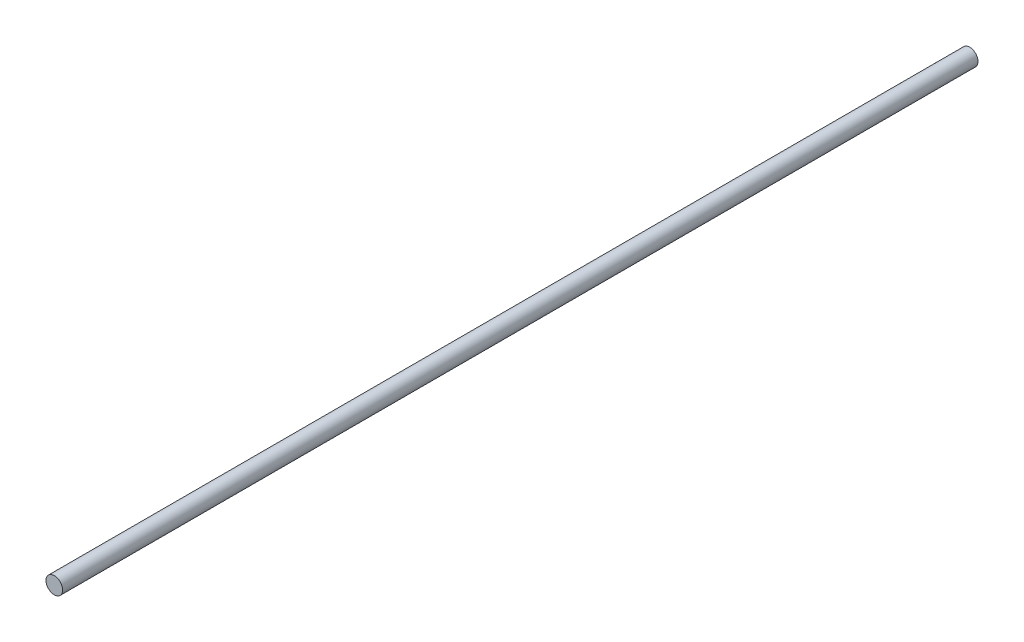
ISO-10303-21;
HEADER;
FILE_DESCRIPTION(('STEP AP214'),'2;1');
FILE_NAME('part.step','',(''),(''),'','','');
FILE_SCHEMA(('AUTOMOTIVE_DESIGN { 1 0 10303 214 1 1 1 1 }'));
ENDSEC;
DATA;
#1=APPLICATION_CONTEXT('core data for automotive mechanical design processes');
#2=APPLICATION_PROTOCOL_DEFINITION('international standard','automotive_design',2000,#1);
#3=PRODUCT_CONTEXT('',#1,'mechanical');
#4=PRODUCT('Part','Part','',(#3));
#5=PRODUCT_RELATED_PRODUCT_CATEGORY('part','',(#4));
#6=PRODUCT_DEFINITION_FORMATION('','',#4);
#7=PRODUCT_DEFINITION_CONTEXT('part definition',#1,'design');
#8=PRODUCT_DEFINITION('design','',#6,#7);
#9=PRODUCT_DEFINITION_SHAPE('','',#8);
#10=(LENGTH_UNIT() NAMED_UNIT(*) SI_UNIT(.MILLI.,.METRE.));
#11=(NAMED_UNIT(*) PLANE_ANGLE_UNIT() SI_UNIT($,.RADIAN.));
#12=(NAMED_UNIT(*) SI_UNIT($,.STERADIAN.) SOLID_ANGLE_UNIT());
#13=UNCERTAINTY_MEASURE_WITH_UNIT(LENGTH_MEASURE(1.E-05),#10,'distance_accuracy_value','');
#14=(GEOMETRIC_REPRESENTATION_CONTEXT(3) GLOBAL_UNCERTAINTY_ASSIGNED_CONTEXT((#13)) GLOBAL_UNIT_ASSIGNED_CONTEXT((#10,
#11,#12)) REPRESENTATION_CONTEXT('',''));
#15=CARTESIAN_POINT('',(0.,0.,0.));
#16=DIRECTION('',(0.,0.,1.));
#17=DIRECTION('',(1.,0.,0.));
#18=AXIS2_PLACEMENT_3D('',#15,#16,#17);
#19=CARTESIAN_POINT('',(585.82877483887,-54.8048450130893,372.15669913756));
#20=DIRECTION('',(0.,0.,1.));
#21=DIRECTION('',(1.,0.,0.));
#22=AXIS2_PLACEMENT_3D('',#19,#20,#21);
#23=CYLINDRICAL_SURFACE('',#22,4.);
#24=CARTESIAN_POINT('',(585.82877483887,-54.8048450130893,372.15669913756));
#25=DIRECTION('',(0.,0.,1.));
#26=DIRECTION('',(1.,0.,0.));
#27=AXIS2_PLACEMENT_3D('',#24,#25,#26);
#28=CIRCLE('',#27,4.);
#29=CARTESIAN_POINT('',(589.82877483887,-54.8048450130893,372.15669913756));
#30=VERTEX_POINT('',#29);
#31=EDGE_CURVE('E10',#30,#30,#28,.T.);
#32=ORIENTED_EDGE('',*,*,#31,.T.);
#33=EDGE_LOOP('',(#32));
#34=FACE_BOUND('',#33,.T.);
#35=CARTESIAN_POINT('',(585.82877483887,-54.8048450130893,812.156699137525));
#36=DIRECTION('',(0.,0.,1.));
#37=DIRECTION('',(1.,0.,0.));
#38=AXIS2_PLACEMENT_3D('',#35,#36,#37);
#39=CIRCLE('',#38,4.);
#40=CARTESIAN_POINT('',(589.82877483887,-54.8048450130893,812.156699137525));
#41=VERTEX_POINT('',#40);
#42=EDGE_CURVE('E36',#41,#41,#39,.T.);
#43=ORIENTED_EDGE('',*,*,#42,.F.);
#44=EDGE_LOOP('',(#43));
#45=FACE_BOUND('',#44,.T.);
#46=ADVANCED_FACE('F30',(#34,#45),#23,.T.);
#47=CARTESIAN_POINT('',(589.82877483887,-54.8048450130893,372.15669913756));
#48=DIRECTION('',(0.,0.,-1.));
#49=DIRECTION('',(-1.,0.,0.));
#50=AXIS2_PLACEMENT_3D('',#47,#48,#49);
#51=PLANE('',#50);
#52=ORIENTED_EDGE('',*,*,#31,.F.);
#53=EDGE_LOOP('',(#52));
#54=FACE_BOUND('',#53,.T.);
#55=ADVANCED_FACE('F45',(#54),#51,.T.);
#56=CARTESIAN_POINT('',(585.82877483887,-54.8048450130893,812.156699137525));
#57=DIRECTION('',(0.,0.,1.));
#58=DIRECTION('',(1.,0.,0.));
#59=AXIS2_PLACEMENT_3D('',#56,#57,#58);
#60=PLANE('',#59);
#61=ORIENTED_EDGE('',*,*,#42,.T.);
#62=EDGE_LOOP('',(#61));
#63=FACE_BOUND('',#62,.T.);
#64=ADVANCED_FACE('F42',(#63),#60,.T.);
#65=CLOSED_SHELL('',(#46,#55,#64));
#66=MANIFOLD_SOLID_BREP('B2',#65);
#67=ADVANCED_BREP_SHAPE_REPRESENTATION('',(#18,#66),#14);
#68=SHAPE_DEFINITION_REPRESENTATION(#9,#67);
ENDSEC;
END-ISO-10303-21;
